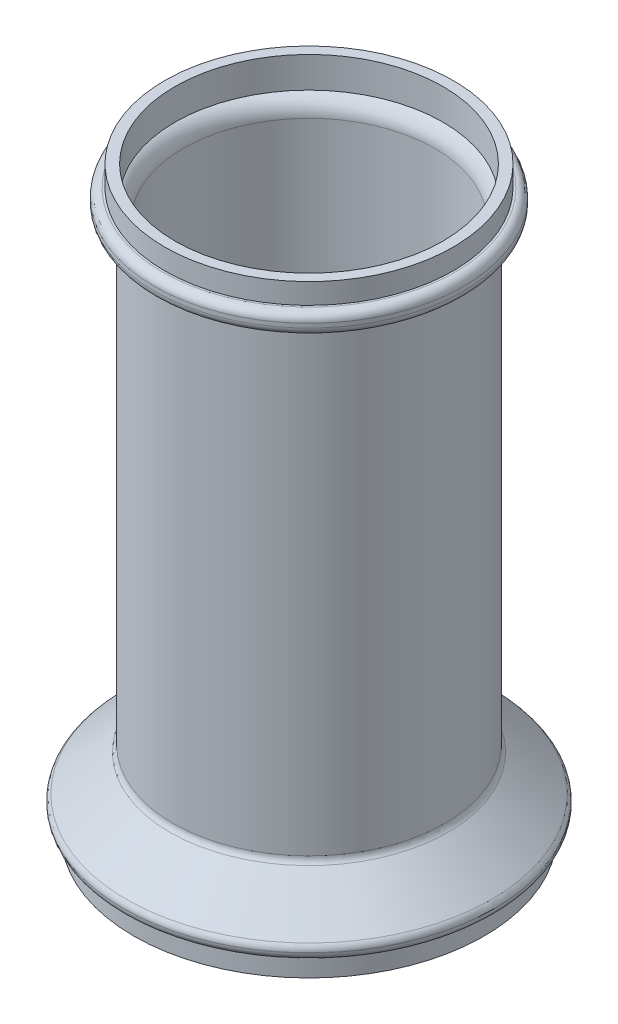
ISO-10303-21;
HEADER;
FILE_DESCRIPTION(('STEP AP214'),'2;1');
FILE_NAME('part.step','',(''),(''),'','','');
FILE_SCHEMA(('AUTOMOTIVE_DESIGN { 1 0 10303 214 1 1 1 1 }'));
ENDSEC;
DATA;
#1=APPLICATION_CONTEXT('core data for automotive mechanical design processes');
#2=APPLICATION_PROTOCOL_DEFINITION('international standard','automotive_design',2000,#1);
#3=PRODUCT_CONTEXT('',#1,'mechanical');
#4=PRODUCT('Part','Part','',(#3));
#5=PRODUCT_RELATED_PRODUCT_CATEGORY('part','',(#4));
#6=PRODUCT_DEFINITION_FORMATION('','',#4);
#7=PRODUCT_DEFINITION_CONTEXT('part definition',#1,'design');
#8=PRODUCT_DEFINITION('design','',#6,#7);
#9=PRODUCT_DEFINITION_SHAPE('','',#8);
#10=(LENGTH_UNIT() NAMED_UNIT(*) SI_UNIT(.MILLI.,.METRE.));
#11=(NAMED_UNIT(*) PLANE_ANGLE_UNIT() SI_UNIT($,.RADIAN.));
#12=(NAMED_UNIT(*) SI_UNIT($,.STERADIAN.) SOLID_ANGLE_UNIT());
#13=UNCERTAINTY_MEASURE_WITH_UNIT(LENGTH_MEASURE(1.E-05),#10,'distance_accuracy_value','');
#14=(GEOMETRIC_REPRESENTATION_CONTEXT(3) GLOBAL_UNCERTAINTY_ASSIGNED_CONTEXT((#13)) GLOBAL_UNIT_ASSIGNED_CONTEXT((#10,
#11,#12)) REPRESENTATION_CONTEXT('',''));
#15=CARTESIAN_POINT('',(0.,0.,0.));
#16=DIRECTION('',(0.,0.,1.));
#17=DIRECTION('',(1.,0.,0.));
#18=AXIS2_PLACEMENT_3D('',#15,#16,#17);
#19=CARTESIAN_POINT('',(0.,5.,0.));
#20=DIRECTION('',(0.,-1.,0.));
#21=DIRECTION('',(0.,0.,-1.));
#22=AXIS2_PLACEMENT_3D('',#19,#20,#21);
#23=CYLINDRICAL_SURFACE('',#22,42.5);
#24=CARTESIAN_POINT('',(0.,5.,0.));
#25=DIRECTION('',(0.,1.,0.));
#26=DIRECTION('',(0.,0.,1.));
#27=AXIS2_PLACEMENT_3D('',#24,#25,#26);
#28=CIRCLE('',#27,42.5);
#29=CARTESIAN_POINT('',(0.,5.,42.5));
#30=VERTEX_POINT('',#29);
#31=EDGE_CURVE('E85',#30,#30,#28,.T.);
#32=ORIENTED_EDGE('',*,*,#31,.F.);
#33=EDGE_LOOP('',(#32));
#34=FACE_BOUND('',#33,.T.);
#35=CARTESIAN_POINT('',(0.,0.,0.));
#36=DIRECTION('',(0.,1.,0.));
#37=DIRECTION('',(0.,0.,1.));
#38=AXIS2_PLACEMENT_3D('',#35,#36,#37);
#39=CIRCLE('',#38,42.5);
#40=CARTESIAN_POINT('',(0.,0.,42.5));
#41=VERTEX_POINT('',#40);
#42=EDGE_CURVE('E86',#41,#41,#39,.T.);
#43=ORIENTED_EDGE('',*,*,#42,.T.);
#44=EDGE_LOOP('',(#43));
#45=FACE_BOUND('',#44,.T.);
#46=ADVANCED_FACE('F41',(#34,#45),#23,.T.);
#47=CARTESIAN_POINT('',(0.,0.,0.));
#48=DIRECTION('',(0.,1.,0.));
#49=DIRECTION('',(0.,0.,1.));
#50=AXIS2_PLACEMENT_3D('',#47,#48,#49);
#51=PLANE('',#50);
#52=CARTESIAN_POINT('',(0.,0.,0.));
#53=DIRECTION('',(0.,1.,0.));
#54=DIRECTION('',(0.,0.,1.));
#55=AXIS2_PLACEMENT_3D('',#52,#53,#54);
#56=CIRCLE('',#55,40.);
#57=CARTESIAN_POINT('',(0.,0.,40.));
#58=VERTEX_POINT('',#57);
#59=EDGE_CURVE('E104',#58,#58,#56,.T.);
#60=ORIENTED_EDGE('',*,*,#59,.T.);
#61=EDGE_LOOP('',(#60));
#62=FACE_BOUND('',#61,.T.);
#63=ORIENTED_EDGE('',*,*,#42,.F.);
#64=EDGE_LOOP('',(#63));
#65=FACE_BOUND('',#64,.T.);
#66=ADVANCED_FACE('F144',(#62,#65),#51,.F.);
#67=CARTESIAN_POINT('',(0.,8.,0.));
#68=DIRECTION('',(0.,-1.,0.));
#69=DIRECTION('',(0.,0.,-1.));
#70=AXIS2_PLACEMENT_3D('',#67,#68,#69);
#71=CYLINDRICAL_SURFACE('',#70,45.);
#72=CARTESIAN_POINT('',(0.,7.,0.));
#73=DIRECTION('',(0.,1.,0.));
#74=DIRECTION('',(0.,0.,1.));
#75=AXIS2_PLACEMENT_3D('',#72,#73,#74);
#76=CIRCLE('',#75,45.);
#77=CARTESIAN_POINT('',(0.,7.,45.));
#78=VERTEX_POINT('',#77);
#79=EDGE_CURVE('E79',#78,#78,#76,.T.);
#80=ORIENTED_EDGE('',*,*,#79,.T.);
#81=EDGE_LOOP('',(#80));
#82=FACE_BOUND('',#81,.T.);
#83=CARTESIAN_POINT('',(0.,7.06325010803112,0.));
#84=DIRECTION('',(0.,-1.,0.));
#85=DIRECTION('',(0.,0.,-1.));
#86=AXIS2_PLACEMENT_3D('',#83,#84,#85);
#87=CIRCLE('',#86,45.);
#88=CARTESIAN_POINT('',(0.,7.06325010803112,-45.));
#89=VERTEX_POINT('',#88);
#90=EDGE_CURVE('E82',#89,#89,#87,.T.);
#91=ORIENTED_EDGE('',*,*,#90,.T.);
#92=EDGE_LOOP('',(#91));
#93=FACE_BOUND('',#92,.T.);
#94=ADVANCED_FACE('F150',(#82,#93),#71,.T.);
#95=CARTESIAN_POINT('',(0.,5.,0.));
#96=DIRECTION('',(0.,1.,0.));
#97=DIRECTION('',(0.,0.,1.));
#98=AXIS2_PLACEMENT_3D('',#95,#96,#97);
#99=PLANE('',#98);
#100=CARTESIAN_POINT('',(0.,5.,0.));
#101=DIRECTION('',(0.,1.,0.));
#102=DIRECTION('',(0.,0.,1.));
#103=AXIS2_PLACEMENT_3D('',#100,#101,#102);
#104=CIRCLE('',#103,43.);
#105=CARTESIAN_POINT('',(0.,5.,43.));
#106=VERTEX_POINT('',#105);
#107=EDGE_CURVE('E76',#106,#106,#104,.F.);
#108=ORIENTED_EDGE('',*,*,#107,.T.);
#109=EDGE_LOOP('',(#108));
#110=FACE_BOUND('',#109,.T.);
#111=ORIENTED_EDGE('',*,*,#31,.T.);
#112=EDGE_LOOP('',(#111));
#113=FACE_BOUND('',#112,.T.);
#114=ADVANCED_FACE('F205',(#110,#113),#99,.F.);
#115=CARTESIAN_POINT('',(0.,18.,0.));
#116=DIRECTION('',(0.,-1.,0.));
#117=DIRECTION('',(0.,0.,-1.));
#118=AXIS2_PLACEMENT_3D('',#115,#116,#117);
#119=CONICAL_SURFACE('',#118,33.,0.876058050598193);
#120=CARTESIAN_POINT('',(0.,8.59969266722588,0.));
#121=DIRECTION('',(0.,-1.,0.));
#122=DIRECTION('',(0.,0.,-1.));
#123=AXIS2_PLACEMENT_3D('',#120,#121,#122);
#124=CIRCLE('',#123,44.280368799329);
#125=CARTESIAN_POINT('',(0.,8.59969266722588,-44.280368799329));
#126=VERTEX_POINT('',#125);
#127=EDGE_CURVE('E70',#126,#126,#124,.F.);
#128=ORIENTED_EDGE('',*,*,#127,.T.);
#129=EDGE_LOOP('',(#128));
#130=FACE_BOUND('',#129,.T.);
#131=CARTESIAN_POINT('',(0.,17.4003073327741,0.));
#132=DIRECTION('',(0.,1.,0.));
#133=DIRECTION('',(0.,0.,1.));
#134=AXIS2_PLACEMENT_3D('',#131,#132,#133);
#135=CIRCLE('',#134,33.7196312006711);
#136=CARTESIAN_POINT('',(0.,17.4003073327741,33.7196312006711));
#137=VERTEX_POINT('',#136);
#138=EDGE_CURVE('E73',#137,#137,#135,.F.);
#139=ORIENTED_EDGE('',*,*,#138,.T.);
#140=EDGE_LOOP('',(#139));
#141=FACE_BOUND('',#140,.T.);
#142=ADVANCED_FACE('F198',(#130,#141),#119,.T.);
#143=CARTESIAN_POINT('',(0.,131.,0.));
#144=DIRECTION('',(0.,-1.,0.));
#145=DIRECTION('',(0.,0.,-1.));
#146=AXIS2_PLACEMENT_3D('',#143,#144,#145);
#147=CYLINDRICAL_SURFACE('',#146,33.);
#148=CARTESIAN_POINT('',(0.,129.,0.));
#149=DIRECTION('',(0.,1.,0.));
#150=DIRECTION('',(0.,0.,1.));
#151=AXIS2_PLACEMENT_3D('',#148,#149,#150);
#152=CIRCLE('',#151,33.);
#153=CARTESIAN_POINT('',(0.,129.,33.));
#154=VERTEX_POINT('',#153);
#155=EDGE_CURVE('E61',#154,#154,#152,.F.);
#156=ORIENTED_EDGE('',*,*,#155,.T.);
#157=EDGE_LOOP('',(#156));
#158=FACE_BOUND('',#157,.T.);
#159=CARTESIAN_POINT('',(0.,18.9367498919689,0.));
#160=DIRECTION('',(0.,1.,0.));
#161=DIRECTION('',(0.,0.,1.));
#162=AXIS2_PLACEMENT_3D('',#159,#160,#161);
#163=CIRCLE('',#162,33.);
#164=CARTESIAN_POINT('',(0.,18.9367498919689,33.));
#165=VERTEX_POINT('',#164);
#166=EDGE_CURVE('E64',#165,#165,#163,.T.);
#167=ORIENTED_EDGE('',*,*,#166,.T.);
#168=EDGE_LOOP('',(#167));
#169=FACE_BOUND('',#168,.T.);
#170=ADVANCED_FACE('F188',(#158,#169),#147,.T.);
#171=CARTESIAN_POINT('',(0.,136.,0.));
#172=DIRECTION('',(0.,-1.,0.));
#173=DIRECTION('',(0.,0.,-1.));
#174=AXIS2_PLACEMENT_3D('',#171,#172,#173);
#175=CYLINDRICAL_SURFACE('',#174,37.5);
#176=CARTESIAN_POINT('',(0.,133.,0.));
#177=DIRECTION('',(0.,1.,0.));
#178=DIRECTION('',(0.,0.,1.));
#179=AXIS2_PLACEMENT_3D('',#176,#177,#178);
#180=CIRCLE('',#179,37.5);
#181=CARTESIAN_POINT('',(0.,133.,37.5));
#182=VERTEX_POINT('',#181);
#183=EDGE_CURVE('E52',#182,#182,#180,.T.);
#184=ORIENTED_EDGE('',*,*,#183,.T.);
#185=EDGE_LOOP('',(#184));
#186=FACE_BOUND('',#185,.T.);
#187=CARTESIAN_POINT('',(0.,134.,0.));
#188=DIRECTION('',(0.,1.,0.));
#189=DIRECTION('',(0.,0.,1.));
#190=AXIS2_PLACEMENT_3D('',#187,#188,#189);
#191=CIRCLE('',#190,37.5);
#192=CARTESIAN_POINT('',(0.,134.,37.5));
#193=VERTEX_POINT('',#192);
#194=EDGE_CURVE('E56',#193,#193,#191,.F.);
#195=ORIENTED_EDGE('',*,*,#194,.T.);
#196=EDGE_LOOP('',(#195));
#197=FACE_BOUND('',#196,.T.);
#198=ADVANCED_FACE('F184',(#186,#197),#175,.T.);
#199=CARTESIAN_POINT('',(0.,136.,0.));
#200=DIRECTION('',(0.,1.,0.));
#201=DIRECTION('',(0.,0.,1.));
#202=AXIS2_PLACEMENT_3D('',#199,#200,#201);
#203=PLANE('',#202);
#204=CARTESIAN_POINT('',(0.,136.,0.));
#205=DIRECTION('',(0.,1.,0.));
#206=DIRECTION('',(0.,0.,1.));
#207=AXIS2_PLACEMENT_3D('',#204,#205,#206);
#208=CIRCLE('',#207,35.);
#209=CARTESIAN_POINT('',(0.,136.,35.));
#210=VERTEX_POINT('',#209);
#211=EDGE_CURVE('E92',#210,#210,#208,.T.);
#212=ORIENTED_EDGE('',*,*,#211,.F.);
#213=EDGE_LOOP('',(#212));
#214=FACE_BOUND('',#213,.T.);
#215=CARTESIAN_POINT('',(0.,136.,0.));
#216=DIRECTION('',(0.,1.,0.));
#217=DIRECTION('',(0.,0.,1.));
#218=AXIS2_PLACEMENT_3D('',#215,#216,#217);
#219=CIRCLE('',#218,35.5);
#220=CARTESIAN_POINT('',(0.,136.,35.5));
#221=VERTEX_POINT('',#220);
#222=EDGE_CURVE('E11',#221,#221,#219,.T.);
#223=ORIENTED_EDGE('',*,*,#222,.T.);
#224=EDGE_LOOP('',(#223));
#225=FACE_BOUND('',#224,.T.);
#226=ADVANCED_FACE('F187',(#214,#225),#203,.T.);
#227=CARTESIAN_POINT('',(0.,131.,0.));
#228=DIRECTION('',(0.,1.,0.));
#229=DIRECTION('',(0.,0.,1.));
#230=AXIS2_PLACEMENT_3D('',#227,#228,#229);
#231=PLANE('',#230);
#232=CARTESIAN_POINT('',(0.,131.,0.));
#233=DIRECTION('',(0.,1.,0.));
#234=DIRECTION('',(0.,0.,1.));
#235=AXIS2_PLACEMENT_3D('',#232,#233,#234);
#236=CIRCLE('',#235,35.5);
#237=CARTESIAN_POINT('',(0.,131.,35.5));
#238=VERTEX_POINT('',#237);
#239=EDGE_CURVE('E48',#238,#238,#236,.F.);
#240=ORIENTED_EDGE('',*,*,#239,.T.);
#241=EDGE_LOOP('',(#240));
#242=FACE_BOUND('',#241,.T.);
#243=CARTESIAN_POINT('',(0.,131.,0.));
#244=DIRECTION('',(0.,1.,0.));
#245=DIRECTION('',(0.,0.,1.));
#246=AXIS2_PLACEMENT_3D('',#243,#244,#245);
#247=CIRCLE('',#246,35.);
#248=CARTESIAN_POINT('',(0.,131.,35.));
#249=VERTEX_POINT('',#248);
#250=EDGE_CURVE('E67',#249,#249,#247,.T.);
#251=ORIENTED_EDGE('',*,*,#250,.T.);
#252=EDGE_LOOP('',(#251));
#253=FACE_BOUND('',#252,.T.);
#254=ADVANCED_FACE('F161',(#242,#253),#231,.F.);
#255=CARTESIAN_POINT('',(0.,7.,0.));
#256=DIRECTION('',(0.,1.,0.));
#257=DIRECTION('',(0.,0.,1.));
#258=AXIS2_PLACEMENT_3D('',#255,#256,#257);
#259=TOROIDAL_SURFACE('',#258,43.,2.);
#260=ORIENTED_EDGE('',*,*,#107,.F.);
#261=EDGE_LOOP('',(#260));
#262=FACE_BOUND('',#261,.T.);
#263=ORIENTED_EDGE('',*,*,#79,.F.);
#264=EDGE_LOOP('',(#263));
#265=FACE_BOUND('',#264,.T.);
#266=ADVANCED_FACE('F157',(#262,#265),#259,.T.);
#267=CARTESIAN_POINT('',(0.,7.06325010803112,0.));
#268=DIRECTION('',(0.,-1.,0.));
#269=DIRECTION('',(0.,0.,-1.));
#270=AXIS2_PLACEMENT_3D('',#267,#268,#269);
#271=TOROIDAL_SURFACE('',#270,43.,2.);
#272=ORIENTED_EDGE('',*,*,#90,.F.);
#273=EDGE_LOOP('',(#272));
#274=FACE_BOUND('',#273,.T.);
#275=ORIENTED_EDGE('',*,*,#127,.F.);
#276=EDGE_LOOP('',(#275));
#277=FACE_BOUND('',#276,.T.);
#278=ADVANCED_FACE('F160',(#274,#277),#271,.T.);
#279=CARTESIAN_POINT('',(0.,129.,0.));
#280=DIRECTION('',(0.,1.,0.));
#281=DIRECTION('',(0.,0.,1.));
#282=AXIS2_PLACEMENT_3D('',#279,#280,#281);
#283=TOROIDAL_SURFACE('',#282,35.,2.);
#284=ORIENTED_EDGE('',*,*,#155,.F.);
#285=EDGE_LOOP('',(#284));
#286=FACE_BOUND('',#285,.T.);
#287=ORIENTED_EDGE('',*,*,#250,.F.);
#288=EDGE_LOOP('',(#287));
#289=FACE_BOUND('',#288,.T.);
#290=ADVANCED_FACE('F165',(#286,#289),#283,.F.);
#291=CARTESIAN_POINT('',(0.,18.9367498919689,0.));
#292=DIRECTION('',(0.,1.,0.));
#293=DIRECTION('',(0.,0.,1.));
#294=AXIS2_PLACEMENT_3D('',#291,#292,#293);
#295=TOROIDAL_SURFACE('',#294,35.,2.);
#296=ORIENTED_EDGE('',*,*,#138,.F.);
#297=EDGE_LOOP('',(#296));
#298=FACE_BOUND('',#297,.T.);
#299=ORIENTED_EDGE('',*,*,#166,.F.);
#300=EDGE_LOOP('',(#299));
#301=FACE_BOUND('',#300,.T.);
#302=ADVANCED_FACE('F169',(#298,#301),#295,.F.);
#303=CARTESIAN_POINT('',(0.,133.,0.));
#304=DIRECTION('',(0.,1.,0.));
#305=DIRECTION('',(0.,0.,1.));
#306=AXIS2_PLACEMENT_3D('',#303,#304,#305);
#307=TOROIDAL_SURFACE('',#306,35.5,2.);
#308=ORIENTED_EDGE('',*,*,#239,.F.);
#309=EDGE_LOOP('',(#308));
#310=FACE_BOUND('',#309,.T.);
#311=ORIENTED_EDGE('',*,*,#183,.F.);
#312=EDGE_LOOP('',(#311));
#313=FACE_BOUND('',#312,.T.);
#314=ADVANCED_FACE('F172',(#310,#313),#307,.T.);
#315=CARTESIAN_POINT('',(0.,134.,0.));
#316=DIRECTION('',(0.,1.,0.));
#317=DIRECTION('',(0.,0.,1.));
#318=AXIS2_PLACEMENT_3D('',#315,#316,#317);
#319=TOROIDAL_SURFACE('',#318,35.5,2.);
#320=ORIENTED_EDGE('',*,*,#194,.F.);
#321=EDGE_LOOP('',(#320));
#322=FACE_BOUND('',#321,.T.);
#323=ORIENTED_EDGE('',*,*,#222,.F.);
#324=EDGE_LOOP('',(#323));
#325=FACE_BOUND('',#324,.T.);
#326=ADVANCED_FACE('F43',(#322,#325),#319,.T.);
#327=CARTESIAN_POINT('',(0.,141.,0.));
#328=DIRECTION('',(0.,-1.,0.));
#329=DIRECTION('',(0.,0.,-1.));
#330=AXIS2_PLACEMENT_3D('',#327,#328,#329);
#331=CYLINDRICAL_SURFACE('',#330,35.);
#332=CARTESIAN_POINT('',(0.,141.,0.));
#333=DIRECTION('',(0.,1.,0.));
#334=DIRECTION('',(0.,0.,1.));
#335=AXIS2_PLACEMENT_3D('',#332,#333,#334);
#336=CIRCLE('',#335,35.);
#337=CARTESIAN_POINT('',(0.,141.,35.));
#338=VERTEX_POINT('',#337);
#339=EDGE_CURVE('E89',#338,#338,#336,.T.);
#340=ORIENTED_EDGE('',*,*,#339,.F.);
#341=EDGE_LOOP('',(#340));
#342=FACE_BOUND('',#341,.T.);
#343=ORIENTED_EDGE('',*,*,#211,.T.);
#344=EDGE_LOOP('',(#343));
#345=FACE_BOUND('',#344,.T.);
#346=ADVANCED_FACE('F179',(#342,#345),#331,.T.);
#347=CARTESIAN_POINT('',(0.,141.,0.));
#348=DIRECTION('',(0.,1.,0.));
#349=DIRECTION('',(0.,0.,1.));
#350=AXIS2_PLACEMENT_3D('',#347,#348,#349);
#351=PLANE('',#350);
#352=CARTESIAN_POINT('',(0.,141.,0.));
#353=DIRECTION('',(0.,1.,0.));
#354=DIRECTION('',(0.,0.,1.));
#355=AXIS2_PLACEMENT_3D('',#352,#353,#354);
#356=CIRCLE('',#355,32.5);
#357=CARTESIAN_POINT('',(0.,141.,32.5));
#358=VERTEX_POINT('',#357);
#359=EDGE_CURVE('E101',#358,#358,#356,.T.);
#360=ORIENTED_EDGE('',*,*,#359,.F.);
#361=EDGE_LOOP('',(#360));
#362=FACE_BOUND('',#361,.T.);
#363=ORIENTED_EDGE('',*,*,#339,.T.);
#364=EDGE_LOOP('',(#363));
#365=FACE_BOUND('',#364,.T.);
#366=ADVANCED_FACE('F297',(#362,#365),#351,.T.);
#367=CARTESIAN_POINT('',(0.,16.0794468010066,0.));
#368=DIRECTION('',(0.,-1.,0.));
#369=DIRECTION('',(0.,0.,-1.));
#370=AXIS2_PLACEMENT_3D('',#367,#368,#369);
#371=CONICAL_SURFACE('',#370,31.3995390008388,0.876058050598193);
#372=CARTESIAN_POINT('',(0.,15.4797541337807,0.));
#373=DIRECTION('',(0.,-1.,0.));
#374=DIRECTION('',(0.,0.,-1.));
#375=AXIS2_PLACEMENT_3D('',#372,#373,#374);
#376=CIRCLE('',#375,32.1191702015099);
#377=CARTESIAN_POINT('',(0.,15.4797541337807,-32.1191702015099));
#378=VERTEX_POINT('',#377);
#379=EDGE_CURVE('E119',#378,#378,#376,.T.);
#380=ORIENTED_EDGE('',*,*,#379,.F.);
#381=EDGE_LOOP('',(#380));
#382=FACE_BOUND('',#381,.T.);
#383=CARTESIAN_POINT('',(0.,7.5,0.));
#384=DIRECTION('',(0.,1.,0.));
#385=DIRECTION('',(0.,0.,1.));
#386=AXIS2_PLACEMENT_3D('',#383,#384,#385);
#387=CIRCLE('',#386,41.6948751620467);
#388=CARTESIAN_POINT('',(0.,7.5,41.6948751620467));
#389=VERTEX_POINT('',#388);
#390=EDGE_CURVE('E95',#389,#389,#387,.T.);
#391=ORIENTED_EDGE('',*,*,#390,.F.);
#392=EDGE_LOOP('',(#391));
#393=FACE_BOUND('',#392,.T.);
#394=ADVANCED_FACE('F140',(#382,#393),#371,.F.);
#395=CARTESIAN_POINT('',(0.,5.,0.));
#396=DIRECTION('',(0.,-1.,0.));
#397=DIRECTION('',(0.,0.,-1.));
#398=AXIS2_PLACEMENT_3D('',#395,#396,#397);
#399=CYLINDRICAL_SURFACE('',#398,40.);
#400=CARTESIAN_POINT('',(0.,7.5,0.));
#401=DIRECTION('',(0.,1.,0.));
#402=DIRECTION('',(0.,0.,1.));
#403=AXIS2_PLACEMENT_3D('',#400,#401,#402);
#404=CIRCLE('',#403,40.);
#405=CARTESIAN_POINT('',(0.,7.5,40.));
#406=VERTEX_POINT('',#405);
#407=EDGE_CURVE('E108',#406,#406,#404,.T.);
#408=ORIENTED_EDGE('',*,*,#407,.T.);
#409=EDGE_LOOP('',(#408));
#410=FACE_BOUND('',#409,.T.);
#411=ORIENTED_EDGE('',*,*,#59,.F.);
#412=EDGE_LOOP('',(#411));
#413=FACE_BOUND('',#412,.T.);
#414=ADVANCED_FACE('F125',(#410,#413),#399,.F.);
#415=CARTESIAN_POINT('',(0.,7.5,0.));
#416=DIRECTION('',(0.,1.,0.));
#417=DIRECTION('',(0.,0.,1.));
#418=AXIS2_PLACEMENT_3D('',#415,#416,#417);
#419=PLANE('',#418);
#420=ORIENTED_EDGE('',*,*,#390,.T.);
#421=EDGE_LOOP('',(#420));
#422=FACE_BOUND('',#421,.T.);
#423=ORIENTED_EDGE('',*,*,#407,.F.);
#424=EDGE_LOOP('',(#423));
#425=FACE_BOUND('',#424,.T.);
#426=ADVANCED_FACE('F128',(#422,#425),#419,.T.);
#427=CARTESIAN_POINT('',(0.,131.,0.));
#428=DIRECTION('',(0.,-1.,0.));
#429=DIRECTION('',(0.,0.,-1.));
#430=AXIS2_PLACEMENT_3D('',#427,#428,#429);
#431=CYLINDRICAL_SURFACE('',#430,30.5);
#432=CARTESIAN_POINT('',(0.,129.,0.));
#433=DIRECTION('',(0.,-1.,0.));
#434=DIRECTION('',(0.,0.,-1.));
#435=AXIS2_PLACEMENT_3D('',#432,#433,#434);
#436=CIRCLE('',#435,30.5);
#437=CARTESIAN_POINT('',(0.,129.,-30.5));
#438=VERTEX_POINT('',#437);
#439=EDGE_CURVE('E113',#438,#438,#436,.T.);
#440=ORIENTED_EDGE('',*,*,#439,.F.);
#441=EDGE_LOOP('',(#440));
#442=FACE_BOUND('',#441,.T.);
#443=CARTESIAN_POINT('',(0.,18.9367498919689,0.));
#444=DIRECTION('',(0.,-1.,0.));
#445=DIRECTION('',(0.,0.,-1.));
#446=AXIS2_PLACEMENT_3D('',#443,#444,#445);
#447=CIRCLE('',#446,30.5);
#448=CARTESIAN_POINT('',(0.,18.9367498919689,-30.5));
#449=VERTEX_POINT('',#448);
#450=EDGE_CURVE('E116',#449,#449,#447,.F.);
#451=ORIENTED_EDGE('',*,*,#450,.F.);
#452=EDGE_LOOP('',(#451));
#453=FACE_BOUND('',#452,.T.);
#454=ADVANCED_FACE('F130',(#442,#453),#431,.F.);
#455=CARTESIAN_POINT('',(0.,133.5,0.));
#456=DIRECTION('',(0.,1.,0.));
#457=DIRECTION('',(0.,0.,1.));
#458=AXIS2_PLACEMENT_3D('',#455,#456,#457);
#459=PLANE('',#458);
#460=CARTESIAN_POINT('',(0.,133.5,0.));
#461=DIRECTION('',(0.,1.,0.));
#462=DIRECTION('',(0.,0.,1.));
#463=AXIS2_PLACEMENT_3D('',#460,#461,#462);
#464=CIRCLE('',#463,32.5);
#465=CARTESIAN_POINT('',(0.,133.5,32.5));
#466=VERTEX_POINT('',#465);
#467=EDGE_CURVE('E105',#466,#466,#464,.T.);
#468=ORIENTED_EDGE('',*,*,#467,.T.);
#469=EDGE_LOOP('',(#468));
#470=FACE_BOUND('',#469,.T.);
#471=CARTESIAN_POINT('',(0.,133.5,0.));
#472=DIRECTION('',(0.,1.,0.));
#473=DIRECTION('',(0.,0.,1.));
#474=AXIS2_PLACEMENT_3D('',#471,#472,#473);
#475=CIRCLE('',#474,35.);
#476=CARTESIAN_POINT('',(0.,133.5,35.));
#477=VERTEX_POINT('',#476);
#478=EDGE_CURVE('E100',#477,#477,#475,.T.);
#479=ORIENTED_EDGE('',*,*,#478,.F.);
#480=EDGE_LOOP('',(#479));
#481=FACE_BOUND('',#480,.T.);
#482=ADVANCED_FACE('F137',(#470,#481),#459,.F.);
#483=CARTESIAN_POINT('',(0.,129.,0.));
#484=DIRECTION('',(0.,1.,0.));
#485=DIRECTION('',(0.,0.,1.));
#486=AXIS2_PLACEMENT_3D('',#483,#484,#485);
#487=TOROIDAL_SURFACE('',#486,35.,4.5);
#488=ORIENTED_EDGE('',*,*,#439,.T.);
#489=EDGE_LOOP('',(#488));
#490=FACE_BOUND('',#489,.T.);
#491=ORIENTED_EDGE('',*,*,#478,.T.);
#492=EDGE_LOOP('',(#491));
#493=FACE_BOUND('',#492,.T.);
#494=ADVANCED_FACE('F346',(#490,#493),#487,.T.);
#495=CARTESIAN_POINT('',(0.,18.9367498919689,0.));
#496=DIRECTION('',(0.,1.,0.));
#497=DIRECTION('',(0.,0.,1.));
#498=AXIS2_PLACEMENT_3D('',#495,#496,#497);
#499=TOROIDAL_SURFACE('',#498,35.,4.5);
#500=ORIENTED_EDGE('',*,*,#379,.T.);
#501=EDGE_LOOP('',(#500));
#502=FACE_BOUND('',#501,.T.);
#503=ORIENTED_EDGE('',*,*,#450,.T.);
#504=EDGE_LOOP('',(#503));
#505=FACE_BOUND('',#504,.T.);
#506=ADVANCED_FACE('F356',(#502,#505),#499,.T.);
#507=CARTESIAN_POINT('',(0.,141.,0.));
#508=DIRECTION('',(0.,-1.,0.));
#509=DIRECTION('',(0.,0.,-1.));
#510=AXIS2_PLACEMENT_3D('',#507,#508,#509);
#511=CYLINDRICAL_SURFACE('',#510,32.5);
#512=ORIENTED_EDGE('',*,*,#359,.T.);
#513=EDGE_LOOP('',(#512));
#514=FACE_BOUND('',#513,.T.);
#515=ORIENTED_EDGE('',*,*,#467,.F.);
#516=EDGE_LOOP('',(#515));
#517=FACE_BOUND('',#516,.T.);
#518=ADVANCED_FACE('F366',(#514,#517),#511,.F.);
#519=CLOSED_SHELL('',(#46,#66,#94,#114,#142,#170,#198,#226,#254,#266,#278,#290,#302,#314,#326,
#346,#366,#394,#414,#426,#454,#482,#494,#506,#518));
#520=MANIFOLD_SOLID_BREP('B2',#519);
#521=ADVANCED_BREP_SHAPE_REPRESENTATION('',(#18,#520),#14);
#522=SHAPE_DEFINITION_REPRESENTATION(#9,#521);
ENDSEC;
END-ISO-10303-21;
